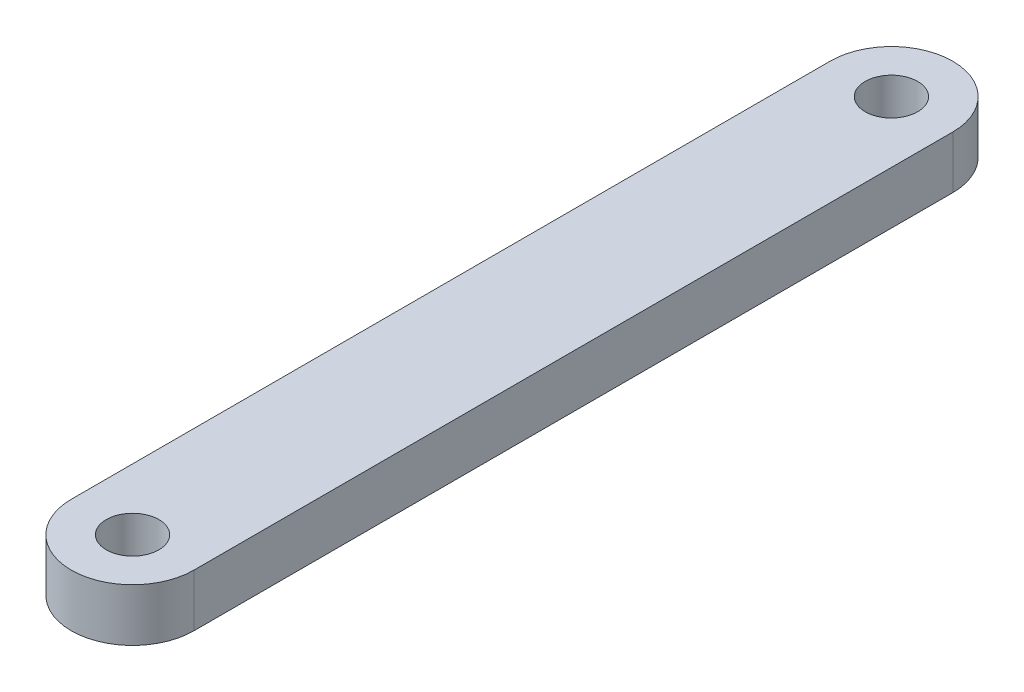
ISO-10303-21;
HEADER;
FILE_DESCRIPTION(('STEP AP214'),'2;1');
FILE_NAME('part.step','',(''),(''),'','','');
FILE_SCHEMA(('AUTOMOTIVE_DESIGN { 1 0 10303 214 1 1 1 1 }'));
ENDSEC;
DATA;
#1=APPLICATION_CONTEXT('core data for automotive mechanical design processes');
#2=APPLICATION_PROTOCOL_DEFINITION('international standard','automotive_design',2000,#1);
#3=PRODUCT_CONTEXT('',#1,'mechanical');
#4=PRODUCT('Part','Part','',(#3));
#5=PRODUCT_RELATED_PRODUCT_CATEGORY('part','',(#4));
#6=PRODUCT_DEFINITION_FORMATION('','',#4);
#7=PRODUCT_DEFINITION_CONTEXT('part definition',#1,'design');
#8=PRODUCT_DEFINITION('design','',#6,#7);
#9=PRODUCT_DEFINITION_SHAPE('','',#8);
#10=(LENGTH_UNIT() NAMED_UNIT(*) SI_UNIT(.MILLI.,.METRE.));
#11=(NAMED_UNIT(*) PLANE_ANGLE_UNIT() SI_UNIT($,.RADIAN.));
#12=(NAMED_UNIT(*) SI_UNIT($,.STERADIAN.) SOLID_ANGLE_UNIT());
#13=UNCERTAINTY_MEASURE_WITH_UNIT(LENGTH_MEASURE(1.E-05),#10,'distance_accuracy_value','');
#14=(GEOMETRIC_REPRESENTATION_CONTEXT(3) GLOBAL_UNCERTAINTY_ASSIGNED_CONTEXT((#13)) GLOBAL_UNIT_ASSIGNED_CONTEXT((#10,
#11,#12)) REPRESENTATION_CONTEXT('',''));
#15=CARTESIAN_POINT('',(0.,0.,0.));
#16=DIRECTION('',(0.,0.,1.));
#17=DIRECTION('',(1.,0.,0.));
#18=AXIS2_PLACEMENT_3D('',#15,#16,#17);
#19=CARTESIAN_POINT('',(0.,3.,21.65));
#20=DIRECTION('',(0.,-1.,0.));
#21=DIRECTION('',(0.,0.,-1.));
#22=AXIS2_PLACEMENT_3D('',#19,#20,#21);
#23=CYLINDRICAL_SURFACE('',#22,3.50000000000001);
#24=CARTESIAN_POINT('',(0.,0.,21.65));
#25=DIRECTION('',(0.,1.,0.));
#26=DIRECTION('',(0.,0.,1.));
#27=AXIS2_PLACEMENT_3D('',#24,#25,#26);
#28=CIRCLE('',#27,3.50000000000001);
#29=CARTESIAN_POINT('',(-3.50000000000001,0.,21.65));
#30=VERTEX_POINT('',#29);
#31=CARTESIAN_POINT('',(3.50000000000001,0.,21.65));
#32=VERTEX_POINT('',#31);
#33=EDGE_CURVE('E98',#30,#32,#28,.T.);
#34=ORIENTED_EDGE('',*,*,#33,.T.);
#35=DIRECTION('',(0.,-1.,0.));
#36=VECTOR('',#35,1.);
#37=CARTESIAN_POINT('',(3.50000000000001,3.,21.65));
#38=LINE('',#37,#36);
#39=CARTESIAN_POINT('',(3.50000000000001,3.,21.65));
#40=VERTEX_POINT('',#39);
#41=EDGE_CURVE('E11',#40,#32,#38,.T.);
#42=ORIENTED_EDGE('',*,*,#41,.F.);
#43=CARTESIAN_POINT('',(0.,3.,21.65));
#44=DIRECTION('',(0.,1.,0.));
#45=DIRECTION('',(0.,0.,1.));
#46=AXIS2_PLACEMENT_3D('',#43,#44,#45);
#47=CIRCLE('',#46,3.50000000000001);
#48=CARTESIAN_POINT('',(-3.50000000000001,3.,21.65));
#49=VERTEX_POINT('',#48);
#50=EDGE_CURVE('E86',#49,#40,#47,.T.);
#51=ORIENTED_EDGE('',*,*,#50,.F.);
#52=DIRECTION('',(0.,-1.,0.));
#53=VECTOR('',#52,1.);
#54=CARTESIAN_POINT('',(-3.50000000000001,3.,21.65));
#55=LINE('',#54,#53);
#56=EDGE_CURVE('E94',#49,#30,#55,.T.);
#57=ORIENTED_EDGE('',*,*,#56,.T.);
#58=EDGE_LOOP('',(#34,#42,#51,#57));
#59=FACE_BOUND('',#58,.T.);
#60=ADVANCED_FACE('F35',(#59),#23,.T.);
#61=CARTESIAN_POINT('',(3.50000000000001,3.,21.65));
#62=DIRECTION('',(-1.,0.,0.));
#63=DIRECTION('',(0.,0.,1.));
#64=AXIS2_PLACEMENT_3D('',#61,#62,#63);
#65=PLANE('',#64);
#66=DIRECTION('',(0.,0.,-1.));
#67=VECTOR('',#66,1.);
#68=CARTESIAN_POINT('',(3.50000000000001,0.,21.65));
#69=LINE('',#68,#67);
#70=CARTESIAN_POINT('',(3.5,0.,-21.65));
#71=VERTEX_POINT('',#70);
#72=EDGE_CURVE('E90',#32,#71,#69,.T.);
#73=ORIENTED_EDGE('',*,*,#72,.T.);
#74=DIRECTION('',(0.,-1.,0.));
#75=VECTOR('',#74,1.);
#76=CARTESIAN_POINT('',(3.5,3.,-21.65));
#77=LINE('',#76,#75);
#78=CARTESIAN_POINT('',(3.5,3.,-21.65));
#79=VERTEX_POINT('',#78);
#80=EDGE_CURVE('E43',#79,#71,#77,.T.);
#81=ORIENTED_EDGE('',*,*,#80,.F.);
#82=DIRECTION('',(0.,0.,-1.));
#83=VECTOR('',#82,1.);
#84=CARTESIAN_POINT('',(3.50000000000001,3.,21.65));
#85=LINE('',#84,#83);
#86=EDGE_CURVE('E81',#40,#79,#85,.T.);
#87=ORIENTED_EDGE('',*,*,#86,.F.);
#88=ORIENTED_EDGE('',*,*,#41,.T.);
#89=EDGE_LOOP('',(#73,#81,#87,#88));
#90=FACE_BOUND('',#89,.T.);
#91=ADVANCED_FACE('F89',(#90),#65,.F.);
#92=CARTESIAN_POINT('',(0.,3.,-21.65));
#93=DIRECTION('',(0.,-1.,0.));
#94=DIRECTION('',(0.,0.,-1.));
#95=AXIS2_PLACEMENT_3D('',#92,#93,#94);
#96=CYLINDRICAL_SURFACE('',#95,3.50000000000001);
#97=CARTESIAN_POINT('',(0.,0.,-21.65));
#98=DIRECTION('',(0.,1.,0.));
#99=DIRECTION('',(0.,0.,1.));
#100=AXIS2_PLACEMENT_3D('',#97,#98,#99);
#101=CIRCLE('',#100,3.50000000000001);
#102=CARTESIAN_POINT('',(-3.50000000000002,0.,-21.65));
#103=VERTEX_POINT('',#102);
#104=EDGE_CURVE('E68',#71,#103,#101,.T.);
#105=ORIENTED_EDGE('',*,*,#104,.T.);
#106=DIRECTION('',(0.,-1.,0.));
#107=VECTOR('',#106,1.);
#108=CARTESIAN_POINT('',(-3.50000000000002,3.,-21.65));
#109=LINE('',#108,#107);
#110=CARTESIAN_POINT('',(-3.50000000000002,3.,-21.65));
#111=VERTEX_POINT('',#110);
#112=EDGE_CURVE('E91',#111,#103,#109,.T.);
#113=ORIENTED_EDGE('',*,*,#112,.F.);
#114=CARTESIAN_POINT('',(0.,3.,-21.65));
#115=DIRECTION('',(0.,1.,0.));
#116=DIRECTION('',(0.,0.,1.));
#117=AXIS2_PLACEMENT_3D('',#114,#115,#116);
#118=CIRCLE('',#117,3.50000000000001);
#119=EDGE_CURVE('E84',#79,#111,#118,.T.);
#120=ORIENTED_EDGE('',*,*,#119,.F.);
#121=ORIENTED_EDGE('',*,*,#80,.T.);
#122=EDGE_LOOP('',(#105,#113,#120,#121));
#123=FACE_BOUND('',#122,.T.);
#124=ADVANCED_FACE('F92',(#123),#96,.T.);
#125=CARTESIAN_POINT('',(-3.50000000000001,3.,21.65));
#126=DIRECTION('',(1.,0.,0.));
#127=DIRECTION('',(0.,0.,-1.));
#128=AXIS2_PLACEMENT_3D('',#125,#126,#127);
#129=PLANE('',#128);
#130=DIRECTION('',(0.,0.,1.));
#131=VECTOR('',#130,1.);
#132=CARTESIAN_POINT('',(-3.50000000000001,0.,21.65));
#133=LINE('',#132,#131);
#134=EDGE_CURVE('E74',#103,#30,#133,.T.);
#135=ORIENTED_EDGE('',*,*,#134,.T.);
#136=ORIENTED_EDGE('',*,*,#56,.F.);
#137=DIRECTION('',(0.,0.,1.));
#138=VECTOR('',#137,1.);
#139=CARTESIAN_POINT('',(-3.50000000000001,3.,21.65));
#140=LINE('',#139,#138);
#141=EDGE_CURVE('E51',#111,#49,#140,.T.);
#142=ORIENTED_EDGE('',*,*,#141,.F.);
#143=ORIENTED_EDGE('',*,*,#112,.T.);
#144=EDGE_LOOP('',(#135,#136,#142,#143));
#145=FACE_BOUND('',#144,.T.);
#146=ADVANCED_FACE('F106',(#145),#129,.F.);
#147=CARTESIAN_POINT('',(0.,3.,21.65));
#148=DIRECTION('',(0.,1.,0.));
#149=DIRECTION('',(0.,0.,1.));
#150=AXIS2_PLACEMENT_3D('',#147,#148,#149);
#151=PLANE('',#150);
#152=CARTESIAN_POINT('',(0.,3.,-21.65));
#153=DIRECTION('',(0.,1.,0.));
#154=DIRECTION('',(0.,0.,1.));
#155=AXIS2_PLACEMENT_3D('',#152,#153,#154);
#156=CIRCLE('',#155,1.5);
#157=CARTESIAN_POINT('',(0.,3.,-20.15));
#158=VERTEX_POINT('',#157);
#159=EDGE_CURVE('E118',#158,#158,#156,.T.);
#160=ORIENTED_EDGE('',*,*,#159,.F.);
#161=EDGE_LOOP('',(#160));
#162=FACE_BOUND('',#161,.T.);
#163=CARTESIAN_POINT('',(0.,3.,21.65));
#164=DIRECTION('',(0.,1.,0.));
#165=DIRECTION('',(0.,0.,1.));
#166=AXIS2_PLACEMENT_3D('',#163,#164,#165);
#167=CIRCLE('',#166,1.5);
#168=CARTESIAN_POINT('',(0.,3.,23.15));
#169=VERTEX_POINT('',#168);
#170=EDGE_CURVE('E112',#169,#169,#167,.T.);
#171=ORIENTED_EDGE('',*,*,#170,.F.);
#172=EDGE_LOOP('',(#171));
#173=FACE_BOUND('',#172,.T.);
#174=ORIENTED_EDGE('',*,*,#50,.T.);
#175=ORIENTED_EDGE('',*,*,#86,.T.);
#176=ORIENTED_EDGE('',*,*,#119,.T.);
#177=ORIENTED_EDGE('',*,*,#141,.T.);
#178=EDGE_LOOP('',(#174,#175,#176,#177));
#179=FACE_BOUND('',#178,.T.);
#180=ADVANCED_FACE('F82',(#162,#173,#179),#151,.T.);
#181=CARTESIAN_POINT('',(0.,0.,21.65));
#182=DIRECTION('',(0.,1.,0.));
#183=DIRECTION('',(0.,0.,1.));
#184=AXIS2_PLACEMENT_3D('',#181,#182,#183);
#185=PLANE('',#184);
#186=CARTESIAN_POINT('',(0.,0.,-21.65));
#187=DIRECTION('',(0.,1.,0.));
#188=DIRECTION('',(0.,0.,1.));
#189=AXIS2_PLACEMENT_3D('',#186,#187,#188);
#190=CIRCLE('',#189,1.5);
#191=CARTESIAN_POINT('',(0.,0.,-20.15));
#192=VERTEX_POINT('',#191);
#193=EDGE_CURVE('E101',#192,#192,#190,.T.);
#194=ORIENTED_EDGE('',*,*,#193,.T.);
#195=EDGE_LOOP('',(#194));
#196=FACE_BOUND('',#195,.T.);
#197=CARTESIAN_POINT('',(0.,0.,21.65));
#198=DIRECTION('',(0.,1.,0.));
#199=DIRECTION('',(0.,0.,1.));
#200=AXIS2_PLACEMENT_3D('',#197,#198,#199);
#201=CIRCLE('',#200,1.5);
#202=CARTESIAN_POINT('',(0.,0.,23.15));
#203=VERTEX_POINT('',#202);
#204=EDGE_CURVE('E115',#203,#203,#201,.T.);
#205=ORIENTED_EDGE('',*,*,#204,.T.);
#206=EDGE_LOOP('',(#205));
#207=FACE_BOUND('',#206,.T.);
#208=ORIENTED_EDGE('',*,*,#33,.F.);
#209=ORIENTED_EDGE('',*,*,#134,.F.);
#210=ORIENTED_EDGE('',*,*,#104,.F.);
#211=ORIENTED_EDGE('',*,*,#72,.F.);
#212=EDGE_LOOP('',(#208,#209,#210,#211));
#213=FACE_BOUND('',#212,.T.);
#214=ADVANCED_FACE('F109',(#196,#207,#213),#185,.F.);
#215=CARTESIAN_POINT('',(0.,0.,21.65));
#216=DIRECTION('',(0.,1.,0.));
#217=DIRECTION('',(0.,0.,1.));
#218=AXIS2_PLACEMENT_3D('',#215,#216,#217);
#219=CYLINDRICAL_SURFACE('',#218,1.5);
#220=ORIENTED_EDGE('',*,*,#204,.F.);
#221=EDGE_LOOP('',(#220));
#222=FACE_BOUND('',#221,.T.);
#223=ORIENTED_EDGE('',*,*,#170,.T.);
#224=EDGE_LOOP('',(#223));
#225=FACE_BOUND('',#224,.T.);
#226=ADVANCED_FACE('F129',(#222,#225),#219,.F.);
#227=CARTESIAN_POINT('',(0.,0.,-21.65));
#228=DIRECTION('',(0.,1.,0.));
#229=DIRECTION('',(0.,0.,1.));
#230=AXIS2_PLACEMENT_3D('',#227,#228,#229);
#231=CYLINDRICAL_SURFACE('',#230,1.5);
#232=ORIENTED_EDGE('',*,*,#193,.F.);
#233=EDGE_LOOP('',(#232));
#234=FACE_BOUND('',#233,.T.);
#235=ORIENTED_EDGE('',*,*,#159,.T.);
#236=EDGE_LOOP('',(#235));
#237=FACE_BOUND('',#236,.T.);
#238=ADVANCED_FACE('F126',(#234,#237),#231,.F.);
#239=CLOSED_SHELL('',(#60,#91,#124,#146,#180,#214,#226,#238));
#240=MANIFOLD_SOLID_BREP('B2',#239);
#241=ADVANCED_BREP_SHAPE_REPRESENTATION('',(#18,#240),#14);
#242=SHAPE_DEFINITION_REPRESENTATION(#9,#241);
ENDSEC;
END-ISO-10303-21;
